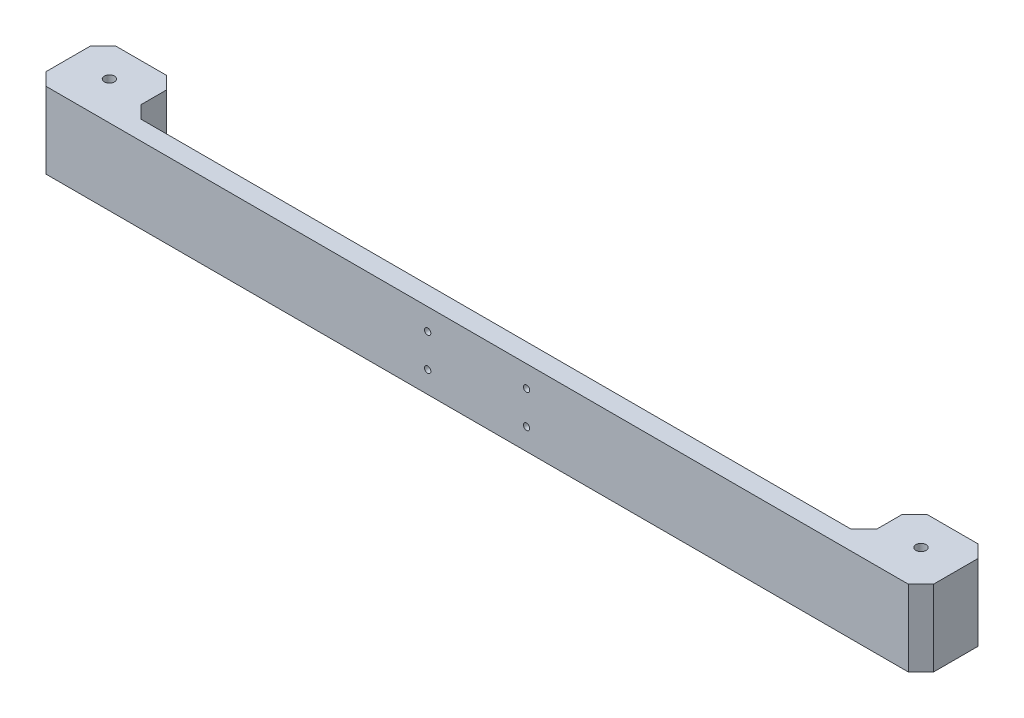
ISO-10303-21;
HEADER;
FILE_DESCRIPTION(('STEP AP214'),'2;1');
FILE_NAME('part.step','',(''),(''),'','','');
FILE_SCHEMA(('AUTOMOTIVE_DESIGN { 1 0 10303 214 1 1 1 1 }'));
ENDSEC;
DATA;
#1=APPLICATION_CONTEXT('core data for automotive mechanical design processes');
#2=APPLICATION_PROTOCOL_DEFINITION('international standard','automotive_design',2000,#1);
#3=PRODUCT_CONTEXT('',#1,'mechanical');
#4=PRODUCT('Part','Part','',(#3));
#5=PRODUCT_RELATED_PRODUCT_CATEGORY('part','',(#4));
#6=PRODUCT_DEFINITION_FORMATION('','',#4);
#7=PRODUCT_DEFINITION_CONTEXT('part definition',#1,'design');
#8=PRODUCT_DEFINITION('design','',#6,#7);
#9=PRODUCT_DEFINITION_SHAPE('','',#8);
#10=(LENGTH_UNIT() NAMED_UNIT(*) SI_UNIT(.MILLI.,.METRE.));
#11=(NAMED_UNIT(*) PLANE_ANGLE_UNIT() SI_UNIT($,.RADIAN.));
#12=(NAMED_UNIT(*) SI_UNIT($,.STERADIAN.) SOLID_ANGLE_UNIT());
#13=UNCERTAINTY_MEASURE_WITH_UNIT(LENGTH_MEASURE(1.E-05),#10,'distance_accuracy_value','');
#14=(GEOMETRIC_REPRESENTATION_CONTEXT(3) GLOBAL_UNCERTAINTY_ASSIGNED_CONTEXT((#13)) GLOBAL_UNIT_ASSIGNED_CONTEXT((#10,
#11,#12)) REPRESENTATION_CONTEXT('',''));
#15=CARTESIAN_POINT('',(0.,0.,0.));
#16=DIRECTION('',(0.,0.,1.));
#17=DIRECTION('',(1.,0.,0.));
#18=AXIS2_PLACEMENT_3D('',#15,#16,#17);
#19=CARTESIAN_POINT('',(290.,60.,0.));
#20=DIRECTION('',(-1.,0.,0.));
#21=DIRECTION('',(0.,0.,1.));
#22=AXIS2_PLACEMENT_3D('',#19,#20,#21);
#23=PLANE('',#22);
#24=DIRECTION('',(0.,0.,-1.));
#25=VECTOR('',#24,1.);
#26=CARTESIAN_POINT('',(290.,60.,0.));
#27=LINE('',#26,#25);
#28=CARTESIAN_POINT('',(290.,60.,25.));
#29=VERTEX_POINT('',#28);
#30=CARTESIAN_POINT('',(290.,60.,4.99999999999999));
#31=VERTEX_POINT('',#30);
#32=EDGE_CURVE('E280',#29,#31,#27,.T.);
#33=ORIENTED_EDGE('',*,*,#32,.T.);
#34=DIRECTION('',(0.,-1.,0.));
#35=VECTOR('',#34,1.);
#36=CARTESIAN_POINT('',(290.,60.,4.99999999999999));
#37=LINE('',#36,#35);
#38=CARTESIAN_POINT('',(290.,0.,4.99999999999999));
#39=VERTEX_POINT('',#38);
#40=EDGE_CURVE('E219',#31,#39,#37,.T.);
#41=ORIENTED_EDGE('',*,*,#40,.T.);
#42=DIRECTION('',(0.,0.,-1.));
#43=VECTOR('',#42,1.);
#44=CARTESIAN_POINT('',(290.,0.,0.));
#45=LINE('',#44,#43);
#46=CARTESIAN_POINT('',(290.,0.,25.));
#47=VERTEX_POINT('',#46);
#48=EDGE_CURVE('E259',#47,#39,#45,.T.);
#49=ORIENTED_EDGE('',*,*,#48,.F.);
#50=DIRECTION('',(0.,1.,0.));
#51=VECTOR('',#50,1.);
#52=CARTESIAN_POINT('',(290.,60.,25.));
#53=LINE('',#52,#51);
#54=EDGE_CURVE('E217',#47,#29,#53,.T.);
#55=ORIENTED_EDGE('',*,*,#54,.T.);
#56=EDGE_LOOP('',(#33,#41,#49,#55));
#57=FACE_BOUND('',#56,.T.);
#58=ADVANCED_FACE('F42',(#57),#23,.T.);
#59=CARTESIAN_POINT('',(0.,60.,35.));
#60=DIRECTION('',(0.,0.,-1.));
#61=DIRECTION('',(-1.,0.,0.));
#62=AXIS2_PLACEMENT_3D('',#59,#60,#61);
#63=PLANE('',#62);
#64=CARTESIAN_POINT('',(-39.,43.,35.));
#65=DIRECTION('',(0.,0.,-1.));
#66=DIRECTION('',(-1.,0.,0.));
#67=AXIS2_PLACEMENT_3D('',#64,#65,#66);
#68=CIRCLE('',#67,2.5);
#69=CARTESIAN_POINT('',(-41.5,43.,35.));
#70=VERTEX_POINT('',#69);
#71=EDGE_CURVE('E293',#70,#70,#68,.T.);
#72=ORIENTED_EDGE('',*,*,#71,.F.);
#73=EDGE_LOOP('',(#72));
#74=FACE_BOUND('',#73,.T.);
#75=CARTESIAN_POINT('',(-39.,17.,35.));
#76=DIRECTION('',(0.,0.,-1.));
#77=DIRECTION('',(-1.,0.,0.));
#78=AXIS2_PLACEMENT_3D('',#75,#76,#77);
#79=CIRCLE('',#78,2.5);
#80=CARTESIAN_POINT('',(-41.5,17.,35.));
#81=VERTEX_POINT('',#80);
#82=EDGE_CURVE('E316',#81,#81,#79,.T.);
#83=ORIENTED_EDGE('',*,*,#82,.F.);
#84=EDGE_LOOP('',(#83));
#85=FACE_BOUND('',#84,.T.);
#86=CARTESIAN_POINT('',(39.,17.,35.));
#87=DIRECTION('',(0.,0.,-1.));
#88=DIRECTION('',(-1.,0.,0.));
#89=AXIS2_PLACEMENT_3D('',#86,#87,#88);
#90=CIRCLE('',#89,2.5);
#91=CARTESIAN_POINT('',(36.5,17.,35.));
#92=VERTEX_POINT('',#91);
#93=EDGE_CURVE('E319',#92,#92,#90,.T.);
#94=ORIENTED_EDGE('',*,*,#93,.F.);
#95=EDGE_LOOP('',(#94));
#96=FACE_BOUND('',#95,.T.);
#97=CARTESIAN_POINT('',(39.,43.,35.));
#98=DIRECTION('',(0.,0.,-1.));
#99=DIRECTION('',(-1.,0.,0.));
#100=AXIS2_PLACEMENT_3D('',#97,#98,#99);
#101=CIRCLE('',#100,2.5);
#102=CARTESIAN_POINT('',(36.5,43.,35.));
#103=VERTEX_POINT('',#102);
#104=EDGE_CURVE('E322',#103,#103,#101,.T.);
#105=ORIENTED_EDGE('',*,*,#104,.F.);
#106=EDGE_LOOP('',(#105));
#107=FACE_BOUND('',#106,.T.);
#108=DIRECTION('',(1.,0.,0.));
#109=VECTOR('',#108,1.);
#110=CARTESIAN_POINT('',(0.,60.,35.));
#111=LINE('',#110,#109);
#112=CARTESIAN_POINT('',(-280.,60.,35.));
#113=VERTEX_POINT('',#112);
#114=CARTESIAN_POINT('',(280.,60.,35.));
#115=VERTEX_POINT('',#114);
#116=EDGE_CURVE('E270',#113,#115,#111,.T.);
#117=ORIENTED_EDGE('',*,*,#116,.T.);
#118=DIRECTION('',(0.,-1.,0.));
#119=VECTOR('',#118,1.);
#120=CARTESIAN_POINT('',(280.,0.,35.));
#121=LINE('',#120,#119);
#122=CARTESIAN_POINT('',(280.,0.,35.));
#123=VERTEX_POINT('',#122);
#124=EDGE_CURVE('E224',#115,#123,#121,.T.);
#125=ORIENTED_EDGE('',*,*,#124,.T.);
#126=DIRECTION('',(1.,0.,0.));
#127=VECTOR('',#126,1.);
#128=CARTESIAN_POINT('',(0.,0.,35.));
#129=LINE('',#128,#127);
#130=CARTESIAN_POINT('',(-280.,0.,35.));
#131=VERTEX_POINT('',#130);
#132=EDGE_CURVE('E248',#131,#123,#129,.T.);
#133=ORIENTED_EDGE('',*,*,#132,.F.);
#134=DIRECTION('',(0.,1.,0.));
#135=VECTOR('',#134,1.);
#136=CARTESIAN_POINT('',(-280.,60.,35.));
#137=LINE('',#136,#135);
#138=EDGE_CURVE('E222',#131,#113,#137,.T.);
#139=ORIENTED_EDGE('',*,*,#138,.T.);
#140=EDGE_LOOP('',(#117,#125,#133,#139));
#141=FACE_BOUND('',#140,.T.);
#142=ADVANCED_FACE('F256',(#74,#85,#96,#107,#141),#63,.T.);
#143=CARTESIAN_POINT('',(-290.,60.,0.));
#144=DIRECTION('',(-1.,0.,0.));
#145=DIRECTION('',(0.,0.,1.));
#146=AXIS2_PLACEMENT_3D('',#143,#144,#145);
#147=PLANE('',#146);
#148=DIRECTION('',(0.,0.,-1.));
#149=VECTOR('',#148,1.);
#150=CARTESIAN_POINT('',(-290.,60.,0.));
#151=LINE('',#150,#149);
#152=CARTESIAN_POINT('',(-290.,60.,24.9999999999999));
#153=VERTEX_POINT('',#152);
#154=CARTESIAN_POINT('',(-290.,60.,4.99999999999999));
#155=VERTEX_POINT('',#154);
#156=EDGE_CURVE('E268',#153,#155,#151,.T.);
#157=ORIENTED_EDGE('',*,*,#156,.F.);
#158=DIRECTION('',(0.,-1.,0.));
#159=VECTOR('',#158,1.);
#160=CARTESIAN_POINT('',(-290.,60.,24.9999999999999));
#161=LINE('',#160,#159);
#162=CARTESIAN_POINT('',(-290.,0.,24.9999999999999));
#163=VERTEX_POINT('',#162);
#164=EDGE_CURVE('E229',#153,#163,#161,.T.);
#165=ORIENTED_EDGE('',*,*,#164,.T.);
#166=DIRECTION('',(0.,0.,-1.));
#167=VECTOR('',#166,1.);
#168=CARTESIAN_POINT('',(-290.,0.,0.));
#169=LINE('',#168,#167);
#170=CARTESIAN_POINT('',(-290.,0.,4.99999999999999));
#171=VERTEX_POINT('',#170);
#172=EDGE_CURVE('E250',#163,#171,#169,.T.);
#173=ORIENTED_EDGE('',*,*,#172,.T.);
#174=DIRECTION('',(0.,1.,0.));
#175=VECTOR('',#174,1.);
#176=CARTESIAN_POINT('',(-290.,60.,4.99999999999999));
#177=LINE('',#176,#175);
#178=EDGE_CURVE('E227',#171,#155,#177,.T.);
#179=ORIENTED_EDGE('',*,*,#178,.T.);
#180=EDGE_LOOP('',(#157,#165,#173,#179));
#181=FACE_BOUND('',#180,.T.);
#182=ADVANCED_FACE('F272',(#181),#147,.F.);
#183=CARTESIAN_POINT('',(0.,60.,-5.00000000000002));
#184=DIRECTION('',(0.,0.,-1.));
#185=DIRECTION('',(-1.,0.,0.));
#186=AXIS2_PLACEMENT_3D('',#183,#184,#185);
#187=PLANE('',#186);
#188=DIRECTION('',(1.,0.,0.));
#189=VECTOR('',#188,1.);
#190=CARTESIAN_POINT('',(0.,60.,-5.00000000000002));
#191=LINE('',#190,#189);
#192=CARTESIAN_POINT('',(-340.,60.,-5.00000000000002));
#193=VERTEX_POINT('',#192);
#194=CARTESIAN_POINT('',(-300.,60.,-5.00000000000002));
#195=VERTEX_POINT('',#194);
#196=EDGE_CURVE('E274',#193,#195,#191,.T.);
#197=ORIENTED_EDGE('',*,*,#196,.T.);
#198=DIRECTION('',(0.,-1.,0.));
#199=VECTOR('',#198,1.);
#200=CARTESIAN_POINT('',(-300.,0.,-5.00000000000002));
#201=LINE('',#200,#199);
#202=CARTESIAN_POINT('',(-300.,0.,-5.00000000000002));
#203=VERTEX_POINT('',#202);
#204=EDGE_CURVE('E234',#195,#203,#201,.T.);
#205=ORIENTED_EDGE('',*,*,#204,.T.);
#206=DIRECTION('',(1.,0.,0.));
#207=VECTOR('',#206,1.);
#208=CARTESIAN_POINT('',(0.,0.,-5.00000000000002));
#209=LINE('',#208,#207);
#210=CARTESIAN_POINT('',(-340.,0.,-5.00000000000002));
#211=VERTEX_POINT('',#210);
#212=EDGE_CURVE('E296',#211,#203,#209,.T.);
#213=ORIENTED_EDGE('',*,*,#212,.F.);
#214=DIRECTION('',(0.,1.,0.));
#215=VECTOR('',#214,1.);
#216=CARTESIAN_POINT('',(-340.,60.,-5.00000000000002));
#217=LINE('',#216,#215);
#218=EDGE_CURVE('E232',#211,#193,#217,.T.);
#219=ORIENTED_EDGE('',*,*,#218,.T.);
#220=EDGE_LOOP('',(#197,#205,#213,#219));
#221=FACE_BOUND('',#220,.T.);
#222=ADVANCED_FACE('F368',(#221),#187,.T.);
#223=CARTESIAN_POINT('',(-350.,60.,0.));
#224=DIRECTION('',(1.,0.,0.));
#225=DIRECTION('',(0.,0.,-1.));
#226=AXIS2_PLACEMENT_3D('',#223,#224,#225);
#227=PLANE('',#226);
#228=DIRECTION('',(0.,0.,1.));
#229=VECTOR('',#228,1.);
#230=CARTESIAN_POINT('',(-350.,0.,0.));
#231=LINE('',#230,#229);
#232=CARTESIAN_POINT('',(-350.,0.,4.99999999999999));
#233=VERTEX_POINT('',#232);
#234=CARTESIAN_POINT('',(-350.,0.,40.));
#235=VERTEX_POINT('',#234);
#236=EDGE_CURVE('E299',#233,#235,#231,.T.);
#237=ORIENTED_EDGE('',*,*,#236,.T.);
#238=DIRECTION('',(0.,1.,0.));
#239=VECTOR('',#238,1.);
#240=CARTESIAN_POINT('',(-350.,60.,40.));
#241=LINE('',#240,#239);
#242=CARTESIAN_POINT('',(-350.,60.,40.));
#243=VERTEX_POINT('',#242);
#244=EDGE_CURVE('E240',#235,#243,#241,.T.);
#245=ORIENTED_EDGE('',*,*,#244,.T.);
#246=DIRECTION('',(0.,0.,1.));
#247=VECTOR('',#246,1.);
#248=CARTESIAN_POINT('',(-350.,60.,0.));
#249=LINE('',#248,#247);
#250=CARTESIAN_POINT('',(-350.,60.,4.99999999999999));
#251=VERTEX_POINT('',#250);
#252=EDGE_CURVE('E277',#251,#243,#249,.T.);
#253=ORIENTED_EDGE('',*,*,#252,.F.);
#254=DIRECTION('',(0.,-1.,0.));
#255=VECTOR('',#254,1.);
#256=CARTESIAN_POINT('',(-350.,0.,4.99999999999999));
#257=LINE('',#256,#255);
#258=EDGE_CURVE('E237',#251,#233,#257,.T.);
#259=ORIENTED_EDGE('',*,*,#258,.T.);
#260=EDGE_LOOP('',(#237,#245,#253,#259));
#261=FACE_BOUND('',#260,.T.);
#262=ADVANCED_FACE('F343',(#261),#227,.F.);
#263=CARTESIAN_POINT('',(0.,60.,50.));
#264=DIRECTION('',(0.,0.,-1.));
#265=DIRECTION('',(-1.,0.,0.));
#266=AXIS2_PLACEMENT_3D('',#263,#264,#265);
#267=PLANE('',#266);
#268=CARTESIAN_POINT('',(-39.,43.,50.));
#269=DIRECTION('',(0.,0.,1.));
#270=DIRECTION('',(-1.,0.,0.));
#271=AXIS2_PLACEMENT_3D('',#268,#269,#270);
#272=CIRCLE('',#271,2.5);
#273=CARTESIAN_POINT('',(-41.5,43.,50.));
#274=VERTEX_POINT('',#273);
#275=EDGE_CURVE('E329',#274,#274,#272,.T.);
#276=ORIENTED_EDGE('',*,*,#275,.F.);
#277=EDGE_LOOP('',(#276));
#278=FACE_BOUND('',#277,.T.);
#279=CARTESIAN_POINT('',(-39.,17.,50.));
#280=DIRECTION('',(0.,0.,1.));
#281=DIRECTION('',(1.,0.,0.));
#282=AXIS2_PLACEMENT_3D('',#279,#280,#281);
#283=CIRCLE('',#282,2.5);
#284=CARTESIAN_POINT('',(-36.5,17.,50.));
#285=VERTEX_POINT('',#284);
#286=EDGE_CURVE('E332',#285,#285,#283,.T.);
#287=ORIENTED_EDGE('',*,*,#286,.F.);
#288=EDGE_LOOP('',(#287));
#289=FACE_BOUND('',#288,.T.);
#290=CARTESIAN_POINT('',(39.,17.,50.));
#291=DIRECTION('',(0.,0.,1.));
#292=DIRECTION('',(-1.,0.,0.));
#293=AXIS2_PLACEMENT_3D('',#290,#291,#292);
#294=CIRCLE('',#293,2.5);
#295=CARTESIAN_POINT('',(36.5,17.,50.));
#296=VERTEX_POINT('',#295);
#297=EDGE_CURVE('E328',#296,#296,#294,.T.);
#298=ORIENTED_EDGE('',*,*,#297,.F.);
#299=EDGE_LOOP('',(#298));
#300=FACE_BOUND('',#299,.T.);
#301=CARTESIAN_POINT('',(39.,43.,50.));
#302=DIRECTION('',(0.,0.,1.));
#303=DIRECTION('',(1.,0.,0.));
#304=AXIS2_PLACEMENT_3D('',#301,#302,#303);
#305=CIRCLE('',#304,2.5);
#306=CARTESIAN_POINT('',(41.5,43.,50.));
#307=VERTEX_POINT('',#306);
#308=EDGE_CURVE('E325',#307,#307,#305,.T.);
#309=ORIENTED_EDGE('',*,*,#308,.F.);
#310=EDGE_LOOP('',(#309));
#311=FACE_BOUND('',#310,.T.);
#312=DIRECTION('',(1.,0.,0.));
#313=VECTOR('',#312,1.);
#314=CARTESIAN_POINT('',(0.,0.,50.));
#315=LINE('',#314,#313);
#316=CARTESIAN_POINT('',(-340.,0.,50.));
#317=VERTEX_POINT('',#316);
#318=CARTESIAN_POINT('',(340.,0.,50.));
#319=VERTEX_POINT('',#318);
#320=EDGE_CURVE('E177',#317,#319,#315,.T.);
#321=ORIENTED_EDGE('',*,*,#320,.T.);
#322=DIRECTION('',(0.,1.,0.));
#323=VECTOR('',#322,1.);
#324=CARTESIAN_POINT('',(340.,60.,50.));
#325=LINE('',#324,#323);
#326=CARTESIAN_POINT('',(340.,60.,50.));
#327=VERTEX_POINT('',#326);
#328=EDGE_CURVE('E201',#319,#327,#325,.T.);
#329=ORIENTED_EDGE('',*,*,#328,.T.);
#330=DIRECTION('',(1.,0.,0.));
#331=VECTOR('',#330,1.);
#332=CARTESIAN_POINT('',(0.,60.,50.));
#333=LINE('',#332,#331);
#334=CARTESIAN_POINT('',(-340.,60.,50.));
#335=VERTEX_POINT('',#334);
#336=EDGE_CURVE('E287',#335,#327,#333,.T.);
#337=ORIENTED_EDGE('',*,*,#336,.F.);
#338=DIRECTION('',(0.,-1.,0.));
#339=VECTOR('',#338,1.);
#340=CARTESIAN_POINT('',(-340.,60.,50.));
#341=LINE('',#340,#339);
#342=EDGE_CURVE('E198',#335,#317,#341,.T.);
#343=ORIENTED_EDGE('',*,*,#342,.T.);
#344=EDGE_LOOP('',(#321,#329,#337,#343));
#345=FACE_BOUND('',#344,.T.);
#346=ADVANCED_FACE('F340',(#278,#289,#300,#311,#345),#267,.F.);
#347=CARTESIAN_POINT('',(350.,60.,0.));
#348=DIRECTION('',(1.,0.,0.));
#349=DIRECTION('',(0.,0.,-1.));
#350=AXIS2_PLACEMENT_3D('',#347,#348,#349);
#351=PLANE('',#350);
#352=DIRECTION('',(0.,0.,1.));
#353=VECTOR('',#352,1.);
#354=CARTESIAN_POINT('',(350.,60.,0.));
#355=LINE('',#354,#353);
#356=CARTESIAN_POINT('',(350.,60.,4.99999999999999));
#357=VERTEX_POINT('',#356);
#358=CARTESIAN_POINT('',(350.,60.,40.));
#359=VERTEX_POINT('',#358);
#360=EDGE_CURVE('E284',#357,#359,#355,.T.);
#361=ORIENTED_EDGE('',*,*,#360,.T.);
#362=DIRECTION('',(0.,-1.,0.));
#363=VECTOR('',#362,1.);
#364=CARTESIAN_POINT('',(350.,0.,40.));
#365=LINE('',#364,#363);
#366=CARTESIAN_POINT('',(350.,0.,40.));
#367=VERTEX_POINT('',#366);
#368=EDGE_CURVE('E176',#359,#367,#365,.T.);
#369=ORIENTED_EDGE('',*,*,#368,.T.);
#370=DIRECTION('',(0.,0.,1.));
#371=VECTOR('',#370,1.);
#372=CARTESIAN_POINT('',(350.,0.,0.));
#373=LINE('',#372,#371);
#374=CARTESIAN_POINT('',(350.,0.,4.99999999999999));
#375=VERTEX_POINT('',#374);
#376=EDGE_CURVE('E161',#375,#367,#373,.T.);
#377=ORIENTED_EDGE('',*,*,#376,.F.);
#378=DIRECTION('',(0.,1.,0.));
#379=VECTOR('',#378,1.);
#380=CARTESIAN_POINT('',(350.,60.,4.99999999999999));
#381=LINE('',#380,#379);
#382=EDGE_CURVE('E174',#375,#357,#381,.T.);
#383=ORIENTED_EDGE('',*,*,#382,.T.);
#384=EDGE_LOOP('',(#361,#369,#377,#383));
#385=FACE_BOUND('',#384,.T.);
#386=ADVANCED_FACE('F173',(#385),#351,.T.);
#387=CARTESIAN_POINT('',(-320.,60.,20.));
#388=DIRECTION('',(0.,-1.,0.));
#389=DIRECTION('',(0.,0.,-1.));
#390=AXIS2_PLACEMENT_3D('',#387,#388,#389);
#391=CYLINDRICAL_SURFACE('',#390,3.99999999999999);
#392=CARTESIAN_POINT('',(-320.,60.,20.));
#393=DIRECTION('',(0.,1.,0.));
#394=DIRECTION('',(0.,0.,1.));
#395=AXIS2_PLACEMENT_3D('',#392,#393,#394);
#396=CIRCLE('',#395,3.99999999999999);
#397=CARTESIAN_POINT('',(-320.,60.,24.));
#398=VERTEX_POINT('',#397);
#399=EDGE_CURVE('E185',#398,#398,#396,.T.);
#400=ORIENTED_EDGE('',*,*,#399,.T.);
#401=EDGE_LOOP('',(#400));
#402=FACE_BOUND('',#401,.T.);
#403=CARTESIAN_POINT('',(-320.,0.,20.));
#404=DIRECTION('',(0.,1.,0.));
#405=DIRECTION('',(0.,0.,1.));
#406=AXIS2_PLACEMENT_3D('',#403,#404,#405);
#407=CIRCLE('',#406,3.99999999999999);
#408=CARTESIAN_POINT('',(-320.,0.,24.));
#409=VERTEX_POINT('',#408);
#410=EDGE_CURVE('E303',#409,#409,#407,.T.);
#411=ORIENTED_EDGE('',*,*,#410,.F.);
#412=EDGE_LOOP('',(#411));
#413=FACE_BOUND('',#412,.T.);
#414=ADVANCED_FACE('F432',(#402,#413),#391,.F.);
#415=CARTESIAN_POINT('',(300.,60.,-5.00000000000002));
#416=VERTEX_POINT('',#415);
#417=CARTESIAN_POINT('',(340.,60.,-5.00000000000002));
#418=VERTEX_POINT('',#417);
#419=EDGE_CURVE('E279',#416,#418,#191,.T.);
#420=ORIENTED_EDGE('',*,*,#419,.T.);
#421=DIRECTION('',(0.,-1.,0.));
#422=VECTOR('',#421,1.);
#423=CARTESIAN_POINT('',(340.,60.,-5.00000000000002));
#424=LINE('',#423,#422);
#425=CARTESIAN_POINT('',(340.,0.,-5.00000000000002));
#426=VERTEX_POINT('',#425);
#427=EDGE_CURVE('E215',#418,#426,#424,.T.);
#428=ORIENTED_EDGE('',*,*,#427,.T.);
#429=CARTESIAN_POINT('',(300.,0.,-5.00000000000002));
#430=VERTEX_POINT('',#429);
#431=EDGE_CURVE('E162',#430,#426,#209,.T.);
#432=ORIENTED_EDGE('',*,*,#431,.F.);
#433=DIRECTION('',(0.,1.,0.));
#434=VECTOR('',#433,1.);
#435=CARTESIAN_POINT('',(300.,60.,-5.00000000000002));
#436=LINE('',#435,#434);
#437=EDGE_CURVE('E65',#430,#416,#436,.T.);
#438=ORIENTED_EDGE('',*,*,#437,.T.);
#439=EDGE_LOOP('',(#420,#428,#432,#438));
#440=FACE_BOUND('',#439,.T.);
#441=ADVANCED_FACE('F429',(#440),#187,.T.);
#442=CARTESIAN_POINT('',(320.,60.,19.9999999999999));
#443=DIRECTION('',(0.,-1.,0.));
#444=DIRECTION('',(0.,0.,-1.));
#445=AXIS2_PLACEMENT_3D('',#442,#443,#444);
#446=CYLINDRICAL_SURFACE('',#445,3.99999999999999);
#447=CARTESIAN_POINT('',(320.,60.,19.9999999999999));
#448=DIRECTION('',(0.,1.,0.));
#449=DIRECTION('',(0.,0.,1.));
#450=AXIS2_PLACEMENT_3D('',#447,#448,#449);
#451=CIRCLE('',#450,3.99999999999999);
#452=CARTESIAN_POINT('',(320.,60.,23.9999999999999));
#453=VERTEX_POINT('',#452);
#454=EDGE_CURVE('E180',#453,#453,#451,.F.);
#455=ORIENTED_EDGE('',*,*,#454,.F.);
#456=EDGE_LOOP('',(#455));
#457=FACE_BOUND('',#456,.T.);
#458=CARTESIAN_POINT('',(320.,0.,19.9999999999999));
#459=DIRECTION('',(0.,1.,0.));
#460=DIRECTION('',(0.,0.,1.));
#461=AXIS2_PLACEMENT_3D('',#458,#459,#460);
#462=CIRCLE('',#461,3.99999999999999);
#463=CARTESIAN_POINT('',(320.,0.,23.9999999999999));
#464=VERTEX_POINT('',#463);
#465=EDGE_CURVE('E188',#464,#464,#462,.F.);
#466=ORIENTED_EDGE('',*,*,#465,.T.);
#467=EDGE_LOOP('',(#466));
#468=FACE_BOUND('',#467,.T.);
#469=ADVANCED_FACE('F431',(#457,#468),#446,.F.);
#470=CARTESIAN_POINT('',(0.,60.,0.));
#471=DIRECTION('',(0.,1.,0.));
#472=DIRECTION('',(0.,0.,1.));
#473=AXIS2_PLACEMENT_3D('',#470,#471,#472);
#474=PLANE('',#473);
#475=ORIENTED_EDGE('',*,*,#336,.T.);
#476=DIRECTION('',(0.707106781186549,0.,-0.707106781186546));
#477=VECTOR('',#476,1.);
#478=CARTESIAN_POINT('',(194.999999999999,60.,195.));
#479=LINE('',#478,#477);
#480=EDGE_CURVE('E212',#327,#359,#479,.T.);
#481=ORIENTED_EDGE('',*,*,#480,.T.);
#482=ORIENTED_EDGE('',*,*,#360,.F.);
#483=DIRECTION('',(0.707106781186546,0.,0.707106781186549));
#484=VECTOR('',#483,1.);
#485=CARTESIAN_POINT('',(172.500000000001,60.,-172.5));
#486=LINE('',#485,#484);
#487=EDGE_CURVE('E58',#357,#418,#486,.F.);
#488=ORIENTED_EDGE('',*,*,#487,.T.);
#489=ORIENTED_EDGE('',*,*,#419,.F.);
#490=DIRECTION('',(0.707106781186549,0.,-0.707106781186546));
#491=VECTOR('',#490,1.);
#492=CARTESIAN_POINT('',(147.499999999999,60.,147.5));
#493=LINE('',#492,#491);
#494=EDGE_CURVE('E209',#416,#31,#493,.F.);
#495=ORIENTED_EDGE('',*,*,#494,.T.);
#496=ORIENTED_EDGE('',*,*,#32,.F.);
#497=DIRECTION('',(0.707106781186553,0.,-0.707106781186542));
#498=VECTOR('',#497,1.);
#499=CARTESIAN_POINT('',(280.,60.,35.));
#500=LINE('',#499,#498);
#501=EDGE_CURVE('E244',#29,#115,#500,.F.);
#502=ORIENTED_EDGE('',*,*,#501,.T.);
#503=ORIENTED_EDGE('',*,*,#116,.F.);
#504=DIRECTION('',(-0.707106781186546,0.,-0.707106781186549));
#505=VECTOR('',#504,1.);
#506=CARTESIAN_POINT('',(-290.,60.,24.9999999999999));
#507=LINE('',#506,#505);
#508=EDGE_CURVE('E11',#113,#153,#507,.T.);
#509=ORIENTED_EDGE('',*,*,#508,.T.);
#510=ORIENTED_EDGE('',*,*,#156,.T.);
#511=DIRECTION('',(-0.707106781186546,0.,-0.707106781186549));
#512=VECTOR('',#511,1.);
#513=CARTESIAN_POINT('',(-147.500000000001,60.,147.5));
#514=LINE('',#513,#512);
#515=EDGE_CURVE('E207',#155,#195,#514,.T.);
#516=ORIENTED_EDGE('',*,*,#515,.T.);
#517=ORIENTED_EDGE('',*,*,#196,.F.);
#518=DIRECTION('',(-0.707106781186549,0.,0.707106781186546));
#519=VECTOR('',#518,1.);
#520=CARTESIAN_POINT('',(-172.499999999999,60.,-172.5));
#521=LINE('',#520,#519);
#522=EDGE_CURVE('E203',#193,#251,#521,.T.);
#523=ORIENTED_EDGE('',*,*,#522,.T.);
#524=ORIENTED_EDGE('',*,*,#252,.T.);
#525=DIRECTION('',(-0.707106781186546,0.,-0.707106781186549));
#526=VECTOR('',#525,1.);
#527=CARTESIAN_POINT('',(-195.000000000001,60.,195.));
#528=LINE('',#527,#526);
#529=EDGE_CURVE('E205',#243,#335,#528,.F.);
#530=ORIENTED_EDGE('',*,*,#529,.T.);
#531=EDGE_LOOP('',(#475,#481,#482,#488,#489,#495,#496,#502,#503,#509,#510,#516,#517,#523,#524,#530));
#532=FACE_BOUND('',#531,.T.);
#533=ORIENTED_EDGE('',*,*,#399,.F.);
#534=EDGE_LOOP('',(#533));
#535=FACE_BOUND('',#534,.T.);
#536=ORIENTED_EDGE('',*,*,#454,.T.);
#537=EDGE_LOOP('',(#536));
#538=FACE_BOUND('',#537,.T.);
#539=ADVANCED_FACE('F266',(#532,#535,#538),#474,.T.);
#540=CARTESIAN_POINT('',(0.,0.,0.));
#541=DIRECTION('',(0.,1.,0.));
#542=DIRECTION('',(0.,0.,1.));
#543=AXIS2_PLACEMENT_3D('',#540,#541,#542);
#544=PLANE('',#543);
#545=ORIENTED_EDGE('',*,*,#376,.T.);
#546=DIRECTION('',(-0.707106781186549,0.,0.707106781186546));
#547=VECTOR('',#546,1.);
#548=CARTESIAN_POINT('',(350.,0.,40.));
#549=LINE('',#548,#547);
#550=EDGE_CURVE('E167',#367,#319,#549,.T.);
#551=ORIENTED_EDGE('',*,*,#550,.T.);
#552=ORIENTED_EDGE('',*,*,#320,.F.);
#553=DIRECTION('',(0.707106781186546,0.,0.707106781186549));
#554=VECTOR('',#553,1.);
#555=CARTESIAN_POINT('',(-340.,0.,50.));
#556=LINE('',#555,#554);
#557=EDGE_CURVE('E192',#317,#235,#556,.F.);
#558=ORIENTED_EDGE('',*,*,#557,.T.);
#559=ORIENTED_EDGE('',*,*,#236,.F.);
#560=DIRECTION('',(0.707106781186549,0.,-0.707106781186546));
#561=VECTOR('',#560,1.);
#562=CARTESIAN_POINT('',(-350.,0.,4.99999999999999));
#563=LINE('',#562,#561);
#564=EDGE_CURVE('E182',#233,#211,#563,.T.);
#565=ORIENTED_EDGE('',*,*,#564,.T.);
#566=ORIENTED_EDGE('',*,*,#212,.T.);
#567=DIRECTION('',(0.707106781186546,0.,0.707106781186549));
#568=VECTOR('',#567,1.);
#569=CARTESIAN_POINT('',(-300.,0.,-5.00000000000002));
#570=LINE('',#569,#568);
#571=EDGE_CURVE('E194',#203,#171,#570,.T.);
#572=ORIENTED_EDGE('',*,*,#571,.T.);
#573=ORIENTED_EDGE('',*,*,#172,.F.);
#574=DIRECTION('',(0.707106781186546,0.,0.707106781186549));
#575=VECTOR('',#574,1.);
#576=CARTESIAN_POINT('',(-157.500000000001,0.,157.5));
#577=LINE('',#576,#575);
#578=EDGE_CURVE('E51',#163,#131,#577,.T.);
#579=ORIENTED_EDGE('',*,*,#578,.T.);
#580=ORIENTED_EDGE('',*,*,#132,.T.);
#581=DIRECTION('',(-0.707106781186553,0.,0.707106781186542));
#582=VECTOR('',#581,1.);
#583=CARTESIAN_POINT('',(157.499999999998,0.,157.5));
#584=LINE('',#583,#582);
#585=EDGE_CURVE('E242',#123,#47,#584,.F.);
#586=ORIENTED_EDGE('',*,*,#585,.T.);
#587=ORIENTED_EDGE('',*,*,#48,.T.);
#588=DIRECTION('',(-0.707106781186549,0.,0.707106781186546));
#589=VECTOR('',#588,1.);
#590=CARTESIAN_POINT('',(290.,0.,4.99999999999999));
#591=LINE('',#590,#589);
#592=EDGE_CURVE('E168',#39,#430,#591,.F.);
#593=ORIENTED_EDGE('',*,*,#592,.T.);
#594=ORIENTED_EDGE('',*,*,#431,.T.);
#595=DIRECTION('',(-0.707106781186546,0.,-0.707106781186549));
#596=VECTOR('',#595,1.);
#597=CARTESIAN_POINT('',(340.,0.,-5.00000000000002));
#598=LINE('',#597,#596);
#599=EDGE_CURVE('E157',#426,#375,#598,.F.);
#600=ORIENTED_EDGE('',*,*,#599,.T.);
#601=EDGE_LOOP('',(#545,#551,#552,#558,#559,#565,#566,#572,#573,#579,#580,#586,#587,#593,#594,#600));
#602=FACE_BOUND('',#601,.T.);
#603=ORIENTED_EDGE('',*,*,#410,.T.);
#604=EDGE_LOOP('',(#603));
#605=FACE_BOUND('',#604,.T.);
#606=ORIENTED_EDGE('',*,*,#465,.F.);
#607=EDGE_LOOP('',(#606));
#608=FACE_BOUND('',#607,.T.);
#609=ADVANCED_FACE('F159',(#602,#605,#608),#544,.F.);
#610=CARTESIAN_POINT('',(350.,60.,40.));
#611=DIRECTION('',(0.707106781186546,0.,0.707106781186549));
#612=DIRECTION('',(0.,1.,0.));
#613=AXIS2_PLACEMENT_3D('',#610,#611,#612);
#614=PLANE('',#613);
#615=ORIENTED_EDGE('',*,*,#480,.F.);
#616=ORIENTED_EDGE('',*,*,#328,.F.);
#617=ORIENTED_EDGE('',*,*,#550,.F.);
#618=ORIENTED_EDGE('',*,*,#368,.F.);
#619=EDGE_LOOP('',(#615,#616,#617,#618));
#620=FACE_BOUND('',#619,.T.);
#621=ADVANCED_FACE('F354',(#620),#614,.T.);
#622=CARTESIAN_POINT('',(340.,60.,-5.00000000000002));
#623=DIRECTION('',(-0.707106781186549,0.,0.707106781186546));
#624=DIRECTION('',(0.,-1.,0.));
#625=AXIS2_PLACEMENT_3D('',#622,#623,#624);
#626=PLANE('',#625);
#627=ORIENTED_EDGE('',*,*,#487,.F.);
#628=ORIENTED_EDGE('',*,*,#382,.F.);
#629=ORIENTED_EDGE('',*,*,#599,.F.);
#630=ORIENTED_EDGE('',*,*,#427,.F.);
#631=EDGE_LOOP('',(#627,#628,#629,#630));
#632=FACE_BOUND('',#631,.T.);
#633=ADVANCED_FACE('F179',(#632),#626,.F.);
#634=CARTESIAN_POINT('',(290.,60.,4.99999999999999));
#635=DIRECTION('',(0.707106781186545,0.,0.707106781186549));
#636=DIRECTION('',(0.,-1.,0.));
#637=AXIS2_PLACEMENT_3D('',#634,#635,#636);
#638=PLANE('',#637);
#639=ORIENTED_EDGE('',*,*,#494,.F.);
#640=ORIENTED_EDGE('',*,*,#437,.F.);
#641=ORIENTED_EDGE('',*,*,#592,.F.);
#642=ORIENTED_EDGE('',*,*,#40,.F.);
#643=EDGE_LOOP('',(#639,#640,#641,#642));
#644=FACE_BOUND('',#643,.T.);
#645=ADVANCED_FACE('F402',(#644),#638,.F.);
#646=CARTESIAN_POINT('',(280.,60.,35.));
#647=DIRECTION('',(-0.707106781186542,0.,-0.707106781186553));
#648=DIRECTION('',(0.,1.,0.));
#649=AXIS2_PLACEMENT_3D('',#646,#647,#648);
#650=PLANE('',#649);
#651=ORIENTED_EDGE('',*,*,#501,.F.);
#652=ORIENTED_EDGE('',*,*,#54,.F.);
#653=ORIENTED_EDGE('',*,*,#585,.F.);
#654=ORIENTED_EDGE('',*,*,#124,.F.);
#655=EDGE_LOOP('',(#651,#652,#653,#654));
#656=FACE_BOUND('',#655,.T.);
#657=ADVANCED_FACE('F379',(#656),#650,.T.);
#658=CARTESIAN_POINT('',(-290.,60.,24.9999999999999));
#659=DIRECTION('',(-0.707106781186549,0.,0.707106781186545));
#660=DIRECTION('',(0.,-1.,0.));
#661=AXIS2_PLACEMENT_3D('',#658,#659,#660);
#662=PLANE('',#661);
#663=ORIENTED_EDGE('',*,*,#508,.F.);
#664=ORIENTED_EDGE('',*,*,#138,.F.);
#665=ORIENTED_EDGE('',*,*,#578,.F.);
#666=ORIENTED_EDGE('',*,*,#164,.F.);
#667=EDGE_LOOP('',(#663,#664,#665,#666));
#668=FACE_BOUND('',#667,.T.);
#669=ADVANCED_FACE('F262',(#668),#662,.F.);
#670=CARTESIAN_POINT('',(-300.,60.,-5.00000000000002));
#671=DIRECTION('',(0.707106781186549,0.,-0.707106781186546));
#672=DIRECTION('',(0.,1.,0.));
#673=AXIS2_PLACEMENT_3D('',#670,#671,#672);
#674=PLANE('',#673);
#675=ORIENTED_EDGE('',*,*,#515,.F.);
#676=ORIENTED_EDGE('',*,*,#178,.F.);
#677=ORIENTED_EDGE('',*,*,#571,.F.);
#678=ORIENTED_EDGE('',*,*,#204,.F.);
#679=EDGE_LOOP('',(#675,#676,#677,#678));
#680=FACE_BOUND('',#679,.T.);
#681=ADVANCED_FACE('F372',(#680),#674,.T.);
#682=CARTESIAN_POINT('',(-340.,60.,50.));
#683=DIRECTION('',(0.707106781186549,0.,-0.707106781186546));
#684=DIRECTION('',(0.,-1.,0.));
#685=AXIS2_PLACEMENT_3D('',#682,#683,#684);
#686=PLANE('',#685);
#687=ORIENTED_EDGE('',*,*,#529,.F.);
#688=ORIENTED_EDGE('',*,*,#244,.F.);
#689=ORIENTED_EDGE('',*,*,#557,.F.);
#690=ORIENTED_EDGE('',*,*,#342,.F.);
#691=EDGE_LOOP('',(#687,#688,#689,#690));
#692=FACE_BOUND('',#691,.T.);
#693=ADVANCED_FACE('F357',(#692),#686,.F.);
#694=CARTESIAN_POINT('',(-350.,60.,4.99999999999999));
#695=DIRECTION('',(-0.707106781186545,0.,-0.707106781186549));
#696=DIRECTION('',(0.,1.,0.));
#697=AXIS2_PLACEMENT_3D('',#694,#695,#696);
#698=PLANE('',#697);
#699=ORIENTED_EDGE('',*,*,#522,.F.);
#700=ORIENTED_EDGE('',*,*,#218,.F.);
#701=ORIENTED_EDGE('',*,*,#564,.F.);
#702=ORIENTED_EDGE('',*,*,#258,.F.);
#703=EDGE_LOOP('',(#699,#700,#701,#702));
#704=FACE_BOUND('',#703,.T.);
#705=ADVANCED_FACE('F45',(#704),#698,.T.);
#706=CARTESIAN_POINT('',(39.,43.,-5.00000000000002));
#707=DIRECTION('',(0.,0.,1.));
#708=DIRECTION('',(1.,0.,0.));
#709=AXIS2_PLACEMENT_3D('',#706,#707,#708);
#710=CYLINDRICAL_SURFACE('',#709,2.5);
#711=ORIENTED_EDGE('',*,*,#104,.T.);
#712=EDGE_LOOP('',(#711));
#713=FACE_BOUND('',#712,.T.);
#714=ORIENTED_EDGE('',*,*,#308,.T.);
#715=EDGE_LOOP('',(#714));
#716=FACE_BOUND('',#715,.T.);
#717=ADVANCED_FACE('F502',(#713,#716),#710,.F.);
#718=CARTESIAN_POINT('',(39.,17.,-5.00000000000002));
#719=DIRECTION('',(0.,0.,1.));
#720=DIRECTION('',(1.,0.,0.));
#721=AXIS2_PLACEMENT_3D('',#718,#719,#720);
#722=CYLINDRICAL_SURFACE('',#721,2.5);
#723=ORIENTED_EDGE('',*,*,#93,.T.);
#724=EDGE_LOOP('',(#723));
#725=FACE_BOUND('',#724,.T.);
#726=ORIENTED_EDGE('',*,*,#297,.T.);
#727=EDGE_LOOP('',(#726));
#728=FACE_BOUND('',#727,.T.);
#729=ADVANCED_FACE('F338',(#725,#728),#722,.F.);
#730=CARTESIAN_POINT('',(-39.,17.,-5.00000000000002));
#731=DIRECTION('',(0.,0.,1.));
#732=DIRECTION('',(1.,0.,0.));
#733=AXIS2_PLACEMENT_3D('',#730,#731,#732);
#734=CYLINDRICAL_SURFACE('',#733,2.5);
#735=ORIENTED_EDGE('',*,*,#82,.T.);
#736=EDGE_LOOP('',(#735));
#737=FACE_BOUND('',#736,.T.);
#738=ORIENTED_EDGE('',*,*,#286,.T.);
#739=EDGE_LOOP('',(#738));
#740=FACE_BOUND('',#739,.T.);
#741=ADVANCED_FACE('F518',(#737,#740),#734,.F.);
#742=CARTESIAN_POINT('',(-39.,43.,-5.00000000000002));
#743=DIRECTION('',(0.,0.,1.));
#744=DIRECTION('',(1.,0.,0.));
#745=AXIS2_PLACEMENT_3D('',#742,#743,#744);
#746=CYLINDRICAL_SURFACE('',#745,2.5);
#747=ORIENTED_EDGE('',*,*,#71,.T.);
#748=EDGE_LOOP('',(#747));
#749=FACE_BOUND('',#748,.T.);
#750=ORIENTED_EDGE('',*,*,#275,.T.);
#751=EDGE_LOOP('',(#750));
#752=FACE_BOUND('',#751,.T.);
#753=ADVANCED_FACE('F528',(#749,#752),#746,.F.);
#754=CLOSED_SHELL('',(#58,#142,#182,#222,#262,#346,#386,#414,#441,#469,#539,#609,#621,#633,#645,
#657,#669,#681,#693,#705,#717,#729,#741,#753));
#755=MANIFOLD_SOLID_BREP('B2',#754);
#756=ADVANCED_BREP_SHAPE_REPRESENTATION('',(#18,#755),#14);
#757=SHAPE_DEFINITION_REPRESENTATION(#9,#756);
ENDSEC;
END-ISO-10303-21;
